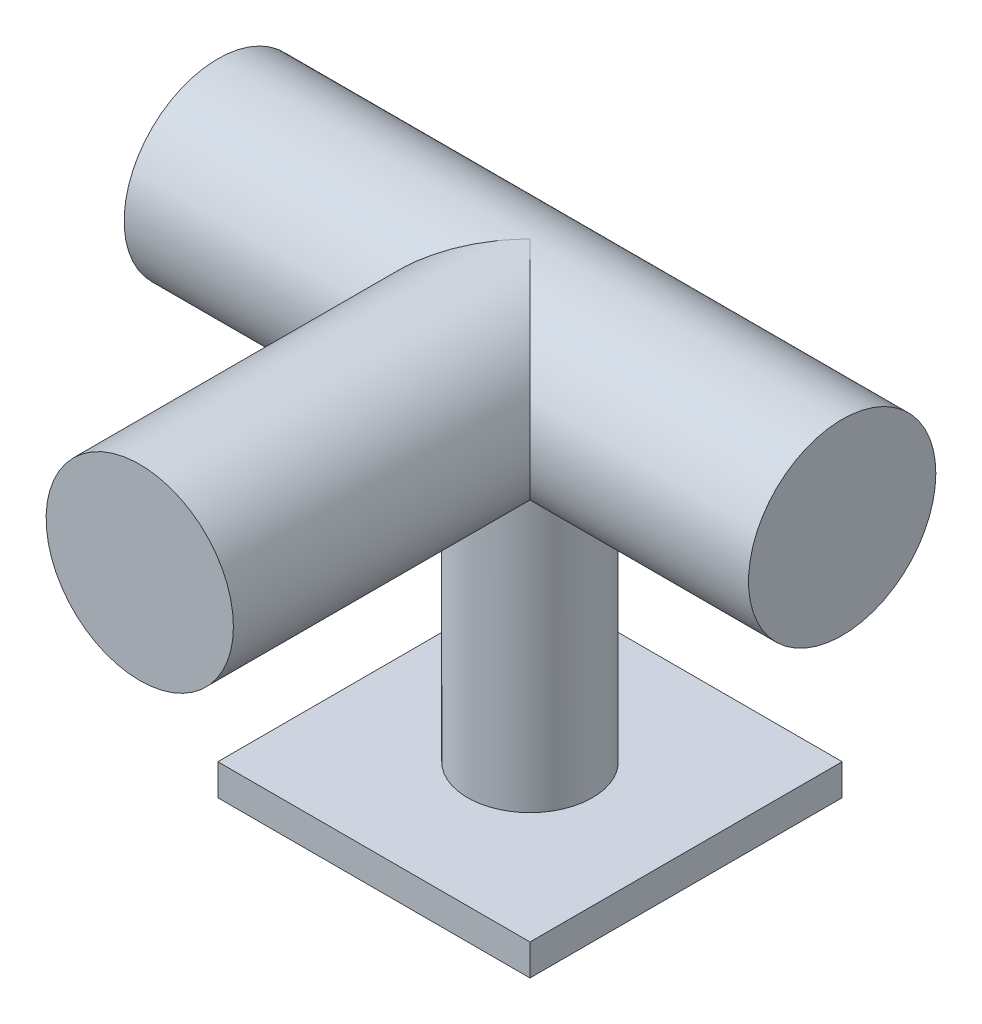
ISO-10303-21;
HEADER;
FILE_DESCRIPTION(('STEP AP214'),'2;1');
FILE_NAME('part.step','',(''),(''),'','','');
FILE_SCHEMA(('AUTOMOTIVE_DESIGN { 1 0 10303 214 1 1 1 1 }'));
ENDSEC;
DATA;
#1=APPLICATION_CONTEXT('core data for automotive mechanical design processes');
#2=APPLICATION_PROTOCOL_DEFINITION('international standard','automotive_design',2000,#1);
#3=PRODUCT_CONTEXT('',#1,'mechanical');
#4=PRODUCT('Part','Part','',(#3));
#5=PRODUCT_RELATED_PRODUCT_CATEGORY('part','',(#4));
#6=PRODUCT_DEFINITION_FORMATION('','',#4);
#7=PRODUCT_DEFINITION_CONTEXT('part definition',#1,'design');
#8=PRODUCT_DEFINITION('design','',#6,#7);
#9=PRODUCT_DEFINITION_SHAPE('','',#8);
#10=(LENGTH_UNIT() NAMED_UNIT(*) SI_UNIT(.MILLI.,.METRE.));
#11=(NAMED_UNIT(*) PLANE_ANGLE_UNIT() SI_UNIT($,.RADIAN.));
#12=(NAMED_UNIT(*) SI_UNIT($,.STERADIAN.) SOLID_ANGLE_UNIT());
#13=UNCERTAINTY_MEASURE_WITH_UNIT(LENGTH_MEASURE(1.E-05),#10,'distance_accuracy_value','');
#14=(GEOMETRIC_REPRESENTATION_CONTEXT(3) GLOBAL_UNCERTAINTY_ASSIGNED_CONTEXT((#13)) GLOBAL_UNIT_ASSIGNED_CONTEXT((#10,
#11,#12)) REPRESENTATION_CONTEXT('',''));
#15=CARTESIAN_POINT('',(0.,0.,0.));
#16=DIRECTION('',(0.,0.,1.));
#17=DIRECTION('',(1.,0.,0.));
#18=AXIS2_PLACEMENT_3D('',#15,#16,#17);
#19=CARTESIAN_POINT('',(0.,20.,0.));
#20=DIRECTION('',(0.,-1.,0.));
#21=DIRECTION('',(0.,0.,-1.));
#22=AXIS2_PLACEMENT_3D('',#19,#20,#21);
#23=CYLINDRICAL_SURFACE('',#22,4.);
#24=CARTESIAN_POINT('',(3.3166247903554,20.,2.23606797749979));
#25=CARTESIAN_POINT('',(3.25178990474856,19.9569815940531,2.33220774476331));
#26=CARTESIAN_POINT('',(3.18297005768135,19.9131586439137,2.42528884211204));
#27=CARTESIAN_POINT('',(3.03761983723579,19.825054895331,2.60504528055408));
#28=CARTESIAN_POINT('',(2.96108710971379,19.7807739608239,2.69171865178704));
#29=CARTESIAN_POINT('',(2.79995862781321,19.6925763954056,2.85898875684497));
#30=CARTESIAN_POINT('',(2.71530241334525,19.6486656477506,2.93953039580786));
#31=CARTESIAN_POINT('',(2.53873229013027,19.5626773765999,3.09330636109127));
#32=CARTESIAN_POINT('',(2.44681888374318,19.5205997265252,3.16654119241323));
#33=CARTESIAN_POINT('',(2.25573113212466,19.4391999373074,3.30540005287153));
#34=CARTESIAN_POINT('',(2.15653382629958,19.3998873497731,3.37099816830734));
#35=CARTESIAN_POINT('',(1.95158526933984,19.3252132051103,3.49364730669478));
#36=CARTESIAN_POINT('',(1.84583499821009,19.2898510593942,3.55069960334508));
#37=CARTESIAN_POINT('',(1.62870624915414,19.2241764843735,3.65537861467507));
#38=CARTESIAN_POINT('',(1.51734700638246,19.1938481495045,3.7030351109673));
#39=CARTESIAN_POINT('',(1.28949339199366,19.1390336552472,3.78840313421628));
#40=CARTESIAN_POINT('',(1.17300001295544,19.1145463724315,3.82611657369872));
#41=CARTESIAN_POINT('',(0.949680124793838,19.0746779129628,3.8871467796178));
#42=CARTESIAN_POINT('',(0.843300417148739,19.0585698059207,3.91162629080952));
#43=CARTESIAN_POINT('',(0.628218954604468,19.0319956675875,3.95187361319682));
#44=CARTESIAN_POINT('',(0.519517598944653,19.0215286742223,3.96764290990328));
#45=CARTESIAN_POINT('',(0.300794834569765,19.0065421774699,3.99018892523902));
#46=CARTESIAN_POINT('',(0.190773640995607,19.0020217177086,3.99696708990308));
#47=CARTESIAN_POINT('',(-0.0295279736174756,18.999061671398,4.0014077347167));
#48=CARTESIAN_POINT('',(-0.139808366839634,19.0006214596643,3.9990711520647));
#49=CARTESIAN_POINT('',(-0.344597394993743,19.0091502634087,3.98626383609797));
#50=CARTESIAN_POINT('',(-0.439211923668113,19.0153550534261,3.97694214484821));
#51=CARTESIAN_POINT('',(-0.627168287404303,19.0321208091171,3.95166638716727));
#52=CARTESIAN_POINT('',(-0.720509736929004,19.0426830654113,3.93571035572618));
#53=CARTESIAN_POINT('',(-0.99756061828948,19.0805842001893,3.87818896176166));
#54=CARTESIAN_POINT('',(-1.1785251689094,19.1141477275733,3.82695539693163));
#55=CARTESIAN_POINT('',(-1.53210355056644,19.1960058684917,3.69983072893639));
#56=CARTESIAN_POINT('',(-1.70447787000161,19.2445817739937,3.62346680690438));
#57=CARTESIAN_POINT('',(-2.03430836867849,19.3527221629977,3.44911953095178));
#58=CARTESIAN_POINT('',(-2.19174923881908,19.4122977424476,3.35111432659441));
#59=CARTESIAN_POINT('',(-2.51131101583835,19.5476943718924,3.12051142748065));
#60=CARTESIAN_POINT('',(-2.67082381262379,19.6246190112042,2.98496195693185));
#61=CARTESIAN_POINT('',(-2.9659153810079,19.7816483374842,2.69193608368737));
#62=CARTESIAN_POINT('',(-3.1015315979938,19.8617478038755,2.53449469048902));
#63=CARTESIAN_POINT('',(-3.25599065853114,19.9601635422977,2.3240830359137));
#64=CARTESIAN_POINT('',(-3.28673686623925,19.9801709934325,2.28039455993877));
#65=CARTESIAN_POINT('',(-3.3166247903554,20.,2.23606797749979));
#66=B_SPLINE_CURVE_WITH_KNOTS('',3,(#24,#25,#26,#27,#28,#29,#30,#31,#32,#33,#34,#35,#36,#37,#38,
#39,#40,#41,#42,#43,#44,#45,#46,#47,#48,#49,#50,#51,#52,#53,#54,#55,#56,#57,#58,#59,#60,#61,#62,
#63,#64,#65),.UNSPECIFIED.,.F.,.F.,(4,2,2,2,2,2,2,2,2,2,2,2,2,2,2,2,2,2,2,2,4),(0.,
0.370927630490387,0.741968821265878,1.11602474086913,1.49005479010199,1.86531916280454,
2.24052754902324,2.61452682064244,2.98845410173222,3.31899239163167,3.64947429142114,
3.9799030336898,4.31029780144148,4.59577469894912,4.88133621150114,5.45177994209244,
6.03363662294168,6.61608349215212,7.28265069753366,7.94816393483148,8.11926008935482),.UNSPECIFIED.);
#67=CARTESIAN_POINT('',(2.82842712474619,19.7084973778708,2.82842712474619));
#68=VERTEX_POINT('',#67);
#69=CARTESIAN_POINT('',(-2.82842712474619,19.7084973778708,2.82842712474619));
#70=VERTEX_POINT('',#69);
#71=EDGE_CURVE('E166',#68,#70,#66,.T.);
#72=ORIENTED_EDGE('',*,*,#71,.T.);
#73=CARTESIAN_POINT('',(-2.23606797749979,20.,3.3166247903554));
#74=CARTESIAN_POINT('',(-2.33220774476331,19.9569815940531,3.25178990474856));
#75=CARTESIAN_POINT('',(-2.42528884211204,19.9131586439137,3.18297005768135));
#76=CARTESIAN_POINT('',(-2.60504528055408,19.825054895331,3.03761983723579));
#77=CARTESIAN_POINT('',(-2.69171865178703,19.7807739608239,2.96108710971379));
#78=CARTESIAN_POINT('',(-2.85898875684497,19.6925763954056,2.79995862781321));
#79=CARTESIAN_POINT('',(-2.93953039580786,19.6486656477506,2.71530241334525));
#80=CARTESIAN_POINT('',(-3.09330636109127,19.5626773765999,2.53873229013026));
#81=CARTESIAN_POINT('',(-3.16654119241323,19.5205997265252,2.44681888374318));
#82=CARTESIAN_POINT('',(-3.30540005287154,19.4391999373074,2.25573113212466));
#83=CARTESIAN_POINT('',(-3.37099816830734,19.3998873497731,2.15653382629958));
#84=CARTESIAN_POINT('',(-3.49364730669478,19.3252132051103,1.95158526933984));
#85=CARTESIAN_POINT('',(-3.55069960334508,19.2898510593942,1.84583499821009));
#86=CARTESIAN_POINT('',(-3.65537861467507,19.2241764843735,1.62870624915414));
#87=CARTESIAN_POINT('',(-3.7030351109673,19.1938481495045,1.51734700638246));
#88=CARTESIAN_POINT('',(-3.78840313421628,19.1390336552472,1.28949339199366));
#89=CARTESIAN_POINT('',(-3.82611657369872,19.1145463724315,1.17300001295544));
#90=CARTESIAN_POINT('',(-3.8871467796178,19.0746779129628,0.949680124793837));
#91=CARTESIAN_POINT('',(-3.91162629080952,19.0585698059207,0.843300417148737));
#92=CARTESIAN_POINT('',(-3.95187361319682,19.0319956675875,0.628218954604466));
#93=CARTESIAN_POINT('',(-3.96764290990328,19.0215286742223,0.519517598944651));
#94=CARTESIAN_POINT('',(-3.99018892523902,19.0065421774699,0.300794834569764));
#95=CARTESIAN_POINT('',(-3.99696708990308,19.0020217177086,0.190773640995605));
#96=CARTESIAN_POINT('',(-4.0014077347167,18.999061671398,-0.0295279736174772));
#97=CARTESIAN_POINT('',(-3.9990711520647,19.0006214596643,-0.139808366839636));
#98=CARTESIAN_POINT('',(-3.98626383609797,19.0091502634087,-0.344597394993745));
#99=CARTESIAN_POINT('',(-3.97694214484821,19.0153550534261,-0.439211923668114));
#100=CARTESIAN_POINT('',(-3.95166638716727,19.0321208091171,-0.627168287404304));
#101=CARTESIAN_POINT('',(-3.93571035572618,19.0426830654113,-0.720509736929006));
#102=CARTESIAN_POINT('',(-3.87818896176166,19.0805842001893,-0.997560618289482));
#103=CARTESIAN_POINT('',(-3.82695539693163,19.1141477275733,-1.17852516890941));
#104=CARTESIAN_POINT('',(-3.69983072893639,19.1960058684917,-1.53210355056644));
#105=CARTESIAN_POINT('',(-3.62346680690437,19.2445817739937,-1.70447787000161));
#106=CARTESIAN_POINT('',(-3.44911953095178,19.3527221629977,-2.03430836867849));
#107=CARTESIAN_POINT('',(-3.35111432659441,19.4122977424476,-2.19174923881908));
#108=CARTESIAN_POINT('',(-3.12051142748065,19.5476943718924,-2.51131101583835));
#109=CARTESIAN_POINT('',(-2.98496195693185,19.6246190112042,-2.67082381262379));
#110=CARTESIAN_POINT('',(-2.69193608368737,19.7816483374842,-2.9659153810079));
#111=CARTESIAN_POINT('',(-2.53449469048902,19.8617478038755,-3.1015315979938));
#112=CARTESIAN_POINT('',(-2.3240830359137,19.9601635422977,-3.25599065853114));
#113=CARTESIAN_POINT('',(-2.28039455993877,19.9801709934325,-3.28673686623925));
#114=CARTESIAN_POINT('',(-2.23606797749979,20.,-3.3166247903554));
#115=B_SPLINE_CURVE_WITH_KNOTS('',3,(#73,#74,#75,#76,#77,#78,#79,#80,#81,#82,#83,#84,#85,#86,
#87,#88,#89,#90,#91,#92,#93,#94,#95,#96,#97,#98,#99,#100,#101,#102,#103,#104,#105,#106,#107,
#108,#109,#110,#111,#112,#113,#114),.UNSPECIFIED.,.F.,.F.,(4,2,2,2,2,2,2,2,2,2,2,2,2,2,2,2,2,2,
2,2,4),(0.,0.370927630490387,0.741968821265878,1.11602474086913,1.49005479010199,
1.86531916280455,2.24052754902324,2.61452682064244,2.98845410173222,3.31899239163168,
3.64947429142114,3.97990303368981,4.31029780144148,4.59577469894912,4.88133621150114,
5.45177994209245,6.03363662294168,6.61608349215212,7.28265069753366,7.94816393483148,
8.11926008935482),.UNSPECIFIED.);
#116=CARTESIAN_POINT('',(-2.23606797749979,20.,-3.3166247903554));
#117=VERTEX_POINT('',#116);
#118=EDGE_CURVE('E151',#70,#117,#115,.T.);
#119=ORIENTED_EDGE('',*,*,#118,.T.);
#120=CARTESIAN_POINT('',(0.,20.,0.));
#121=DIRECTION('',(0.,1.,0.));
#122=DIRECTION('',(0.,0.,1.));
#123=AXIS2_PLACEMENT_3D('',#120,#121,#122);
#124=CIRCLE('',#123,4.);
#125=CARTESIAN_POINT('',(2.23606797749979,20.,-3.3166247903554));
#126=VERTEX_POINT('',#125);
#127=EDGE_CURVE('E135',#126,#117,#124,.T.);
#128=ORIENTED_EDGE('',*,*,#127,.F.);
#129=CARTESIAN_POINT('',(2.23606797749979,20.,-3.3166247903554));
#130=CARTESIAN_POINT('',(2.33220774476331,19.9569815940531,-3.25178990474856));
#131=CARTESIAN_POINT('',(2.42528884211204,19.9131586439137,-3.18297005768135));
#132=CARTESIAN_POINT('',(2.60504528055408,19.825054895331,-3.03761983723579));
#133=CARTESIAN_POINT('',(2.69171865178703,19.7807739608239,-2.96108710971379));
#134=CARTESIAN_POINT('',(2.85898875684497,19.6925763954056,-2.79995862781321));
#135=CARTESIAN_POINT('',(2.93953039580786,19.6486656477506,-2.71530241334525));
#136=CARTESIAN_POINT('',(3.09330636109127,19.5626773765999,-2.53873229013026));
#137=CARTESIAN_POINT('',(3.16654119241323,19.5205997265252,-2.44681888374318));
#138=CARTESIAN_POINT('',(3.30540005287154,19.4391999373074,-2.25573113212466));
#139=CARTESIAN_POINT('',(3.37099816830734,19.3998873497731,-2.15653382629958));
#140=CARTESIAN_POINT('',(3.49364730669478,19.3252132051103,-1.95158526933984));
#141=CARTESIAN_POINT('',(3.55069960334508,19.2898510593942,-1.84583499821009));
#142=CARTESIAN_POINT('',(3.65537861467507,19.2241764843735,-1.62870624915414));
#143=CARTESIAN_POINT('',(3.7030351109673,19.1938481495045,-1.51734700638246));
#144=CARTESIAN_POINT('',(3.78840313421628,19.1390336552472,-1.28949339199366));
#145=CARTESIAN_POINT('',(3.82611657369872,19.1145463724315,-1.17300001295544));
#146=CARTESIAN_POINT('',(3.8871467796178,19.0746779129628,-0.949680124793837));
#147=CARTESIAN_POINT('',(3.91162629080952,19.0585698059207,-0.843300417148737));
#148=CARTESIAN_POINT('',(3.95187361319682,19.0319956675875,-0.628218954604466));
#149=CARTESIAN_POINT('',(3.96764290990328,19.0215286742223,-0.519517598944651));
#150=CARTESIAN_POINT('',(3.99018892523902,19.0065421774699,-0.300794834569764));
#151=CARTESIAN_POINT('',(3.99696708990308,19.0020217177086,-0.190773640995605));
#152=CARTESIAN_POINT('',(4.0014077347167,18.999061671398,0.0295279736174772));
#153=CARTESIAN_POINT('',(3.9990711520647,19.0006214596643,0.139808366839636));
#154=CARTESIAN_POINT('',(3.98626383609797,19.0091502634087,0.344597394993745));
#155=CARTESIAN_POINT('',(3.97694214484821,19.0153550534261,0.439211923668114));
#156=CARTESIAN_POINT('',(3.95166638716727,19.0321208091171,0.627168287404304));
#157=CARTESIAN_POINT('',(3.93571035572618,19.0426830654113,0.720509736929006));
#158=CARTESIAN_POINT('',(3.87818896176166,19.0805842001893,0.997560618289482));
#159=CARTESIAN_POINT('',(3.82695539693163,19.1141477275733,1.17852516890941));
#160=CARTESIAN_POINT('',(3.69983072893639,19.1960058684917,1.53210355056644));
#161=CARTESIAN_POINT('',(3.62346680690437,19.2445817739937,1.70447787000161));
#162=CARTESIAN_POINT('',(3.44911953095178,19.3527221629977,2.03430836867849));
#163=CARTESIAN_POINT('',(3.35111432659441,19.4122977424476,2.19174923881908));
#164=CARTESIAN_POINT('',(3.12051142748065,19.5476943718924,2.51131101583835));
#165=CARTESIAN_POINT('',(2.98496195693185,19.6246190112042,2.67082381262379));
#166=CARTESIAN_POINT('',(2.69193608368737,19.7816483374842,2.9659153810079));
#167=CARTESIAN_POINT('',(2.53449469048902,19.8617478038755,3.1015315979938));
#168=CARTESIAN_POINT('',(2.3240830359137,19.9601635422977,3.25599065853114));
#169=CARTESIAN_POINT('',(2.28039455993877,19.9801709934325,3.28673686623925));
#170=CARTESIAN_POINT('',(2.23606797749979,20.,3.3166247903554));
#171=B_SPLINE_CURVE_WITH_KNOTS('',3,(#129,#130,#131,#132,#133,#134,#135,#136,#137,#138,#139,
#140,#141,#142,#143,#144,#145,#146,#147,#148,#149,#150,#151,#152,#153,#154,#155,#156,#157,#158,
#159,#160,#161,#162,#163,#164,#165,#166,#167,#168,#169,#170),.UNSPECIFIED.,.F.,.F.,(4,2,2,2,2,2,
2,2,2,2,2,2,2,2,2,2,2,2,2,2,4),(0.,0.370927630490387,0.741968821265878,1.11602474086913,
1.49005479010199,1.86531916280455,2.24052754902324,2.61452682064244,2.98845410173222,
3.31899239163168,3.64947429142114,3.97990303368981,4.31029780144148,4.59577469894912,
4.88133621150114,5.45177994209245,6.03363662294168,6.61608349215212,7.28265069753366,
7.94816393483148,8.11926008935482),.UNSPECIFIED.);
#172=EDGE_CURVE('E68',#126,#68,#171,.T.);
#173=ORIENTED_EDGE('',*,*,#172,.T.);
#174=EDGE_LOOP('',(#72,#119,#128,#173));
#175=FACE_BOUND('',#174,.T.);
#176=CARTESIAN_POINT('',(0.,2.,0.));
#177=DIRECTION('',(0.,-1.,0.));
#178=DIRECTION('',(0.,0.,-1.));
#179=AXIS2_PLACEMENT_3D('',#176,#177,#178);
#180=CIRCLE('',#179,4.);
#181=CARTESIAN_POINT('',(0.,2.,-4.));
#182=VERTEX_POINT('',#181);
#183=EDGE_CURVE('E11',#182,#182,#180,.T.);
#184=ORIENTED_EDGE('',*,*,#183,.F.);
#185=EDGE_LOOP('',(#184));
#186=FACE_BOUND('',#185,.T.);
#187=ADVANCED_FACE('F47',(#175,#186),#23,.T.);
#188=CARTESIAN_POINT('',(20.,25.,0.));
#189=DIRECTION('',(-1.,0.,0.));
#190=DIRECTION('',(0.,0.,1.));
#191=AXIS2_PLACEMENT_3D('',#188,#189,#190);
#192=CYLINDRICAL_SURFACE('',#191,6.);
#193=CARTESIAN_POINT('',(20.,25.,0.));
#194=DIRECTION('',(1.,0.,0.));
#195=DIRECTION('',(0.,0.,-1.));
#196=AXIS2_PLACEMENT_3D('',#193,#194,#195);
#197=CIRCLE('',#196,6.);
#198=CARTESIAN_POINT('',(20.,25.,-6.));
#199=VERTEX_POINT('',#198);
#200=EDGE_CURVE('E199',#199,#199,#197,.T.);
#201=ORIENTED_EDGE('',*,*,#200,.F.);
#202=EDGE_LOOP('',(#201));
#203=FACE_BOUND('',#202,.T.);
#204=CARTESIAN_POINT('',(-20.,25.,0.));
#205=DIRECTION('',(1.,0.,0.));
#206=DIRECTION('',(0.,0.,-1.));
#207=AXIS2_PLACEMENT_3D('',#204,#205,#206);
#208=CIRCLE('',#207,6.);
#209=CARTESIAN_POINT('',(-20.,25.,-6.));
#210=VERTEX_POINT('',#209);
#211=EDGE_CURVE('E197',#210,#210,#208,.T.);
#212=ORIENTED_EDGE('',*,*,#211,.T.);
#213=EDGE_LOOP('',(#212));
#214=FACE_BOUND('',#213,.T.);
#215=ORIENTED_EDGE('',*,*,#118,.F.);
#216=CARTESIAN_POINT('',(0.,25.,0.));
#217=DIRECTION('',(-0.707106781186547,0.,-0.707106781186547));
#218=DIRECTION('',(-0.707106781186547,0.,0.707106781186547));
#219=AXIS2_PLACEMENT_3D('',#216,#217,#218);
#220=ELLIPSE('',#219,8.48528137423857,6.);
#221=CARTESIAN_POINT('',(0.,31.,0.));
#222=VERTEX_POINT('',#221);
#223=EDGE_CURVE('E180',#222,#70,#220,.F.);
#224=ORIENTED_EDGE('',*,*,#223,.F.);
#225=CARTESIAN_POINT('',(0.,25.,0.));
#226=DIRECTION('',(-0.707106781186547,0.,0.707106781186547));
#227=DIRECTION('',(-0.707106781186547,0.,-0.707106781186547));
#228=AXIS2_PLACEMENT_3D('',#225,#226,#227);
#229=ELLIPSE('',#228,8.48528137423857,6.);
#230=EDGE_CURVE('E206',#68,#222,#229,.T.);
#231=ORIENTED_EDGE('',*,*,#230,.F.);
#232=ORIENTED_EDGE('',*,*,#172,.F.);
#233=DIRECTION('',(-1.,0.,0.));
#234=VECTOR('',#233,1.);
#235=CARTESIAN_POINT('',(20.,20.,-3.3166247903554));
#236=LINE('',#235,#234);
#237=EDGE_CURVE('E56',#126,#117,#236,.T.);
#238=ORIENTED_EDGE('',*,*,#237,.T.);
#239=EDGE_LOOP('',(#215,#224,#231,#232,#238));
#240=FACE_BOUND('',#239,.T.);
#241=ADVANCED_FACE('F51',(#203,#214,#240),#192,.T.);
#242=CARTESIAN_POINT('',(0.,25.,25.));
#243=DIRECTION('',(0.,0.,-1.));
#244=DIRECTION('',(-1.,0.,0.));
#245=AXIS2_PLACEMENT_3D('',#242,#243,#244);
#246=CYLINDRICAL_SURFACE('',#245,6.);
#247=CARTESIAN_POINT('',(0.,25.,25.));
#248=DIRECTION('',(0.,0.,1.));
#249=DIRECTION('',(1.,0.,0.));
#250=AXIS2_PLACEMENT_3D('',#247,#248,#249);
#251=CIRCLE('',#250,6.);
#252=CARTESIAN_POINT('',(6.,25.,25.));
#253=VERTEX_POINT('',#252);
#254=EDGE_CURVE('E203',#253,#253,#251,.T.);
#255=ORIENTED_EDGE('',*,*,#254,.F.);
#256=EDGE_LOOP('',(#255));
#257=FACE_BOUND('',#256,.T.);
#258=ORIENTED_EDGE('',*,*,#71,.F.);
#259=ORIENTED_EDGE('',*,*,#230,.T.);
#260=ORIENTED_EDGE('',*,*,#223,.T.);
#261=EDGE_LOOP('',(#258,#259,#260));
#262=FACE_BOUND('',#261,.T.);
#263=ADVANCED_FACE('F176',(#257,#262),#246,.T.);
#264=CARTESIAN_POINT('',(20.,25.,0.));
#265=DIRECTION('',(1.,0.,0.));
#266=DIRECTION('',(0.,0.,-1.));
#267=AXIS2_PLACEMENT_3D('',#264,#265,#266);
#268=PLANE('',#267);
#269=ORIENTED_EDGE('',*,*,#200,.T.);
#270=EDGE_LOOP('',(#269));
#271=FACE_BOUND('',#270,.T.);
#272=ADVANCED_FACE('F181',(#271),#268,.T.);
#273=CARTESIAN_POINT('',(-20.,25.,0.));
#274=DIRECTION('',(1.,0.,0.));
#275=DIRECTION('',(0.,0.,-1.));
#276=AXIS2_PLACEMENT_3D('',#273,#274,#275);
#277=PLANE('',#276);
#278=ORIENTED_EDGE('',*,*,#211,.F.);
#279=EDGE_LOOP('',(#278));
#280=FACE_BOUND('',#279,.T.);
#281=ADVANCED_FACE('F188',(#280),#277,.F.);
#282=CARTESIAN_POINT('',(0.,25.,25.));
#283=DIRECTION('',(0.,0.,1.));
#284=DIRECTION('',(1.,0.,0.));
#285=AXIS2_PLACEMENT_3D('',#282,#283,#284);
#286=PLANE('',#285);
#287=ORIENTED_EDGE('',*,*,#254,.T.);
#288=EDGE_LOOP('',(#287));
#289=FACE_BOUND('',#288,.T.);
#290=ADVANCED_FACE('F163',(#289),#286,.T.);
#291=CARTESIAN_POINT('',(0.,20.,0.));
#292=DIRECTION('',(0.,1.,0.));
#293=DIRECTION('',(0.,0.,1.));
#294=AXIS2_PLACEMENT_3D('',#291,#292,#293);
#295=PLANE('',#294);
#296=ORIENTED_EDGE('',*,*,#237,.F.);
#297=ORIENTED_EDGE('',*,*,#127,.T.);
#298=EDGE_LOOP('',(#296,#297));
#299=FACE_BOUND('',#298,.T.);
#300=ADVANCED_FACE('F194',(#299),#295,.T.);
#301=CARTESIAN_POINT('',(10.,2.,10.));
#302=DIRECTION('',(-1.,0.,0.));
#303=DIRECTION('',(0.,0.,1.));
#304=AXIS2_PLACEMENT_3D('',#301,#302,#303);
#305=PLANE('',#304);
#306=DIRECTION('',(0.,0.,-1.));
#307=VECTOR('',#306,1.);
#308=CARTESIAN_POINT('',(10.,0.,10.));
#309=LINE('',#308,#307);
#310=CARTESIAN_POINT('',(10.,0.,10.));
#311=VERTEX_POINT('',#310);
#312=CARTESIAN_POINT('',(10.,0.,-10.));
#313=VERTEX_POINT('',#312);
#314=EDGE_CURVE('E134',#311,#313,#309,.T.);
#315=ORIENTED_EDGE('',*,*,#314,.T.);
#316=DIRECTION('',(0.,-1.,0.));
#317=VECTOR('',#316,1.);
#318=CARTESIAN_POINT('',(10.,2.,-10.));
#319=LINE('',#318,#317);
#320=CARTESIAN_POINT('',(10.,2.,-10.));
#321=VERTEX_POINT('',#320);
#322=EDGE_CURVE('E109',#321,#313,#319,.T.);
#323=ORIENTED_EDGE('',*,*,#322,.F.);
#324=DIRECTION('',(0.,0.,-1.));
#325=VECTOR('',#324,1.);
#326=CARTESIAN_POINT('',(10.,2.,10.));
#327=LINE('',#326,#325);
#328=CARTESIAN_POINT('',(10.,2.,10.));
#329=VERTEX_POINT('',#328);
#330=EDGE_CURVE('E117',#329,#321,#327,.T.);
#331=ORIENTED_EDGE('',*,*,#330,.F.);
#332=DIRECTION('',(0.,-1.,0.));
#333=VECTOR('',#332,1.);
#334=CARTESIAN_POINT('',(10.,2.,10.));
#335=LINE('',#334,#333);
#336=EDGE_CURVE('E256',#329,#311,#335,.T.);
#337=ORIENTED_EDGE('',*,*,#336,.T.);
#338=EDGE_LOOP('',(#315,#323,#331,#337));
#339=FACE_BOUND('',#338,.T.);
#340=ADVANCED_FACE('F128',(#339),#305,.F.);
#341=CARTESIAN_POINT('',(-10.,2.,-10.));
#342=DIRECTION('',(0.,0.,1.));
#343=DIRECTION('',(1.,0.,0.));
#344=AXIS2_PLACEMENT_3D('',#341,#342,#343);
#345=PLANE('',#344);
#346=DIRECTION('',(-1.,0.,0.));
#347=VECTOR('',#346,1.);
#348=CARTESIAN_POINT('',(-10.,0.,-10.));
#349=LINE('',#348,#347);
#350=CARTESIAN_POINT('',(-10.,0.,-10.));
#351=VERTEX_POINT('',#350);
#352=EDGE_CURVE('E241',#313,#351,#349,.T.);
#353=ORIENTED_EDGE('',*,*,#352,.T.);
#354=DIRECTION('',(0.,-1.,0.));
#355=VECTOR('',#354,1.);
#356=CARTESIAN_POINT('',(-10.,2.,-10.));
#357=LINE('',#356,#355);
#358=CARTESIAN_POINT('',(-10.,2.,-10.));
#359=VERTEX_POINT('',#358);
#360=EDGE_CURVE('E114',#359,#351,#357,.T.);
#361=ORIENTED_EDGE('',*,*,#360,.F.);
#362=DIRECTION('',(-1.,0.,0.));
#363=VECTOR('',#362,1.);
#364=CARTESIAN_POINT('',(-10.,2.,-10.));
#365=LINE('',#364,#363);
#366=EDGE_CURVE('E106',#321,#359,#365,.T.);
#367=ORIENTED_EDGE('',*,*,#366,.F.);
#368=ORIENTED_EDGE('',*,*,#322,.T.);
#369=EDGE_LOOP('',(#353,#361,#367,#368));
#370=FACE_BOUND('',#369,.T.);
#371=ADVANCED_FACE('F107',(#370),#345,.F.);
#372=CARTESIAN_POINT('',(-10.,2.,10.));
#373=DIRECTION('',(1.,0.,0.));
#374=DIRECTION('',(0.,0.,-1.));
#375=AXIS2_PLACEMENT_3D('',#372,#373,#374);
#376=PLANE('',#375);
#377=DIRECTION('',(0.,0.,1.));
#378=VECTOR('',#377,1.);
#379=CARTESIAN_POINT('',(-10.,0.,10.));
#380=LINE('',#379,#378);
#381=CARTESIAN_POINT('',(-10.,0.,10.));
#382=VERTEX_POINT('',#381);
#383=EDGE_CURVE('E246',#351,#382,#380,.T.);
#384=ORIENTED_EDGE('',*,*,#383,.T.);
#385=DIRECTION('',(0.,-1.,0.));
#386=VECTOR('',#385,1.);
#387=CARTESIAN_POINT('',(-10.,2.,10.));
#388=LINE('',#387,#386);
#389=CARTESIAN_POINT('',(-10.,2.,10.));
#390=VERTEX_POINT('',#389);
#391=EDGE_CURVE('E138',#390,#382,#388,.T.);
#392=ORIENTED_EDGE('',*,*,#391,.F.);
#393=DIRECTION('',(0.,0.,1.));
#394=VECTOR('',#393,1.);
#395=CARTESIAN_POINT('',(-10.,2.,10.));
#396=LINE('',#395,#394);
#397=EDGE_CURVE('E119',#359,#390,#396,.T.);
#398=ORIENTED_EDGE('',*,*,#397,.F.);
#399=ORIENTED_EDGE('',*,*,#360,.T.);
#400=EDGE_LOOP('',(#384,#392,#398,#399));
#401=FACE_BOUND('',#400,.T.);
#402=ADVANCED_FACE('F228',(#401),#376,.F.);
#403=CARTESIAN_POINT('',(-10.,2.,10.));
#404=DIRECTION('',(0.,0.,-1.));
#405=DIRECTION('',(-1.,0.,0.));
#406=AXIS2_PLACEMENT_3D('',#403,#404,#405);
#407=PLANE('',#406);
#408=DIRECTION('',(1.,0.,0.));
#409=VECTOR('',#408,1.);
#410=CARTESIAN_POINT('',(-10.,0.,10.));
#411=LINE('',#410,#409);
#412=EDGE_CURVE('E126',#382,#311,#411,.T.);
#413=ORIENTED_EDGE('',*,*,#412,.T.);
#414=ORIENTED_EDGE('',*,*,#336,.F.);
#415=DIRECTION('',(1.,0.,0.));
#416=VECTOR('',#415,1.);
#417=CARTESIAN_POINT('',(-10.,2.,10.));
#418=LINE('',#417,#416);
#419=EDGE_CURVE('E124',#390,#329,#418,.T.);
#420=ORIENTED_EDGE('',*,*,#419,.F.);
#421=ORIENTED_EDGE('',*,*,#391,.T.);
#422=EDGE_LOOP('',(#413,#414,#420,#421));
#423=FACE_BOUND('',#422,.T.);
#424=ADVANCED_FACE('F230',(#423),#407,.F.);
#425=CARTESIAN_POINT('',(0.,2.,0.));
#426=DIRECTION('',(0.,-1.,0.));
#427=DIRECTION('',(0.,0.,-1.));
#428=AXIS2_PLACEMENT_3D('',#425,#426,#427);
#429=PLANE('',#428);
#430=ORIENTED_EDGE('',*,*,#183,.T.);
#431=EDGE_LOOP('',(#430));
#432=FACE_BOUND('',#431,.T.);
#433=ORIENTED_EDGE('',*,*,#330,.T.);
#434=ORIENTED_EDGE('',*,*,#366,.T.);
#435=ORIENTED_EDGE('',*,*,#397,.T.);
#436=ORIENTED_EDGE('',*,*,#419,.T.);
#437=EDGE_LOOP('',(#433,#434,#435,#436));
#438=FACE_BOUND('',#437,.T.);
#439=ADVANCED_FACE('F122',(#432,#438),#429,.F.);
#440=CARTESIAN_POINT('',(0.,0.,0.));
#441=DIRECTION('',(0.,1.,0.));
#442=DIRECTION('',(0.,0.,1.));
#443=AXIS2_PLACEMENT_3D('',#440,#441,#442);
#444=PLANE('',#443);
#445=ORIENTED_EDGE('',*,*,#314,.F.);
#446=ORIENTED_EDGE('',*,*,#412,.F.);
#447=ORIENTED_EDGE('',*,*,#383,.F.);
#448=ORIENTED_EDGE('',*,*,#352,.F.);
#449=EDGE_LOOP('',(#445,#446,#447,#448));
#450=FACE_BOUND('',#449,.T.);
#451=ADVANCED_FACE('F165',(#450),#444,.F.);
#452=CLOSED_SHELL('',(#187,#241,#263,#272,#281,#290,#300,#340,#371,#402,#424,#439,#451));
#453=MANIFOLD_SOLID_BREP('B2',#452);
#454=ADVANCED_BREP_SHAPE_REPRESENTATION('',(#18,#453),#14);
#455=SHAPE_DEFINITION_REPRESENTATION(#9,#454);
ENDSEC;
END-ISO-10303-21;
